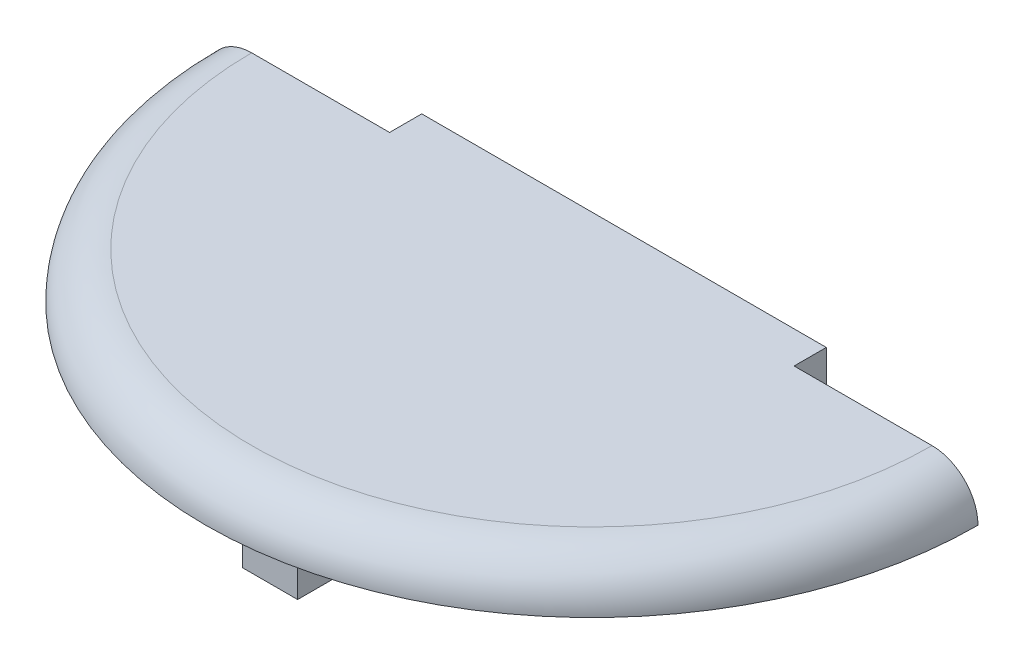
ISO-10303-21;
HEADER;
FILE_DESCRIPTION(('STEP AP214'),'2;1');
FILE_NAME('part.step','',(''),(''),'','','');
FILE_SCHEMA(('AUTOMOTIVE_DESIGN { 1 0 10303 214 1 1 1 1 }'));
ENDSEC;
DATA;
#1=APPLICATION_CONTEXT('core data for automotive mechanical design processes');
#2=APPLICATION_PROTOCOL_DEFINITION('international standard','automotive_design',2000,#1);
#3=PRODUCT_CONTEXT('',#1,'mechanical');
#4=PRODUCT('Part','Part','',(#3));
#5=PRODUCT_RELATED_PRODUCT_CATEGORY('part','',(#4));
#6=PRODUCT_DEFINITION_FORMATION('','',#4);
#7=PRODUCT_DEFINITION_CONTEXT('part definition',#1,'design');
#8=PRODUCT_DEFINITION('design','',#6,#7);
#9=PRODUCT_DEFINITION_SHAPE('','',#8);
#10=(LENGTH_UNIT() NAMED_UNIT(*) SI_UNIT(.MILLI.,.METRE.));
#11=(NAMED_UNIT(*) PLANE_ANGLE_UNIT() SI_UNIT($,.RADIAN.));
#12=(NAMED_UNIT(*) SI_UNIT($,.STERADIAN.) SOLID_ANGLE_UNIT());
#13=UNCERTAINTY_MEASURE_WITH_UNIT(LENGTH_MEASURE(1.E-05),#10,'distance_accuracy_value','');
#14=(GEOMETRIC_REPRESENTATION_CONTEXT(3) GLOBAL_UNCERTAINTY_ASSIGNED_CONTEXT((#13)) GLOBAL_UNIT_ASSIGNED_CONTEXT((#10,
#11,#12)) REPRESENTATION_CONTEXT('',''));
#15=CARTESIAN_POINT('',(0.,0.,0.));
#16=DIRECTION('',(0.,0.,1.));
#17=DIRECTION('',(1.,0.,0.));
#18=AXIS2_PLACEMENT_3D('',#15,#16,#17);
#19=CARTESIAN_POINT('',(-2.99999999999999,47.,32.));
#20=DIRECTION('',(0.,0.,1.));
#21=DIRECTION('',(1.,0.,0.));
#22=AXIS2_PLACEMENT_3D('',#19,#20,#21);
#23=PLANE('',#22);
#24=DIRECTION('',(1.,0.,0.));
#25=VECTOR('',#24,1.);
#26=CARTESIAN_POINT('',(-2.99999999999999,48.,32.));
#27=LINE('',#26,#25);
#28=CARTESIAN_POINT('',(-2.99999999999999,48.,32.));
#29=VERTEX_POINT('',#28);
#30=CARTESIAN_POINT('',(3.00000000000001,48.,32.));
#31=VERTEX_POINT('',#30);
#32=EDGE_CURVE('E12',#29,#31,#27,.T.);
#33=ORIENTED_EDGE('',*,*,#32,.F.);
#34=DIRECTION('',(0.,1.,0.));
#35=VECTOR('',#34,1.);
#36=CARTESIAN_POINT('',(-2.99999999999999,47.,32.));
#37=LINE('',#36,#35);
#38=CARTESIAN_POINT('',(-2.99999999999999,55.,32.));
#39=VERTEX_POINT('',#38);
#40=EDGE_CURVE('E226',#29,#39,#37,.T.);
#41=ORIENTED_EDGE('',*,*,#40,.T.);
#42=DIRECTION('',(1.,0.,0.));
#43=VECTOR('',#42,1.);
#44=CARTESIAN_POINT('',(-2.99999999999999,55.,32.));
#45=LINE('',#44,#43);
#46=CARTESIAN_POINT('',(3.00000000000001,55.,32.));
#47=VERTEX_POINT('',#46);
#48=EDGE_CURVE('E219',#39,#47,#45,.T.);
#49=ORIENTED_EDGE('',*,*,#48,.T.);
#50=DIRECTION('',(0.,1.,0.));
#51=VECTOR('',#50,1.);
#52=CARTESIAN_POINT('',(3.00000000000001,47.,32.));
#53=LINE('',#52,#51);
#54=EDGE_CURVE('E223',#31,#47,#53,.T.);
#55=ORIENTED_EDGE('',*,*,#54,.F.);
#56=EDGE_LOOP('',(#33,#41,#49,#55));
#57=FACE_BOUND('',#56,.T.);
#58=ADVANCED_FACE('F42',(#57),#23,.F.);
#59=CARTESIAN_POINT('',(0.,55.,0.));
#60=DIRECTION('',(0.,1.,0.));
#61=DIRECTION('',(0.,0.,1.));
#62=AXIS2_PLACEMENT_3D('',#59,#60,#61);
#63=PLANE('',#62);
#64=DIRECTION('',(0.,0.,-1.));
#65=VECTOR('',#64,1.);
#66=CARTESIAN_POINT('',(-22.,55.,0.));
#67=LINE('',#66,#65);
#68=CARTESIAN_POINT('',(-22.,55.,0.));
#69=VERTEX_POINT('',#68);
#70=CARTESIAN_POINT('',(-22.,55.,-3.5));
#71=VERTEX_POINT('',#70);
#72=EDGE_CURVE('E144',#69,#71,#67,.T.);
#73=ORIENTED_EDGE('',*,*,#72,.T.);
#74=DIRECTION('',(1.,0.,0.));
#75=VECTOR('',#74,1.);
#76=CARTESIAN_POINT('',(-22.,55.,-3.5));
#77=LINE('',#76,#75);
#78=CARTESIAN_POINT('',(22.,55.,-3.5));
#79=VERTEX_POINT('',#78);
#80=EDGE_CURVE('E130',#71,#79,#77,.T.);
#81=ORIENTED_EDGE('',*,*,#80,.T.);
#82=DIRECTION('',(0.,0.,1.));
#83=VECTOR('',#82,1.);
#84=CARTESIAN_POINT('',(22.,55.,0.));
#85=LINE('',#84,#83);
#86=CARTESIAN_POINT('',(22.,55.,0.));
#87=VERTEX_POINT('',#86);
#88=EDGE_CURVE('E156',#79,#87,#85,.T.);
#89=ORIENTED_EDGE('',*,*,#88,.T.);
#90=DIRECTION('',(1.,0.,0.));
#91=VECTOR('',#90,1.);
#92=CARTESIAN_POINT('',(0.,55.,0.));
#93=LINE('',#92,#91);
#94=CARTESIAN_POINT('',(42.,55.,0.));
#95=VERTEX_POINT('',#94);
#96=EDGE_CURVE('E163',#87,#95,#93,.T.);
#97=ORIENTED_EDGE('',*,*,#96,.T.);
#98=CARTESIAN_POINT('',(0.,55.,0.));
#99=DIRECTION('',(0.,-1.,0.));
#100=DIRECTION('',(0.,0.,-1.));
#101=AXIS2_PLACEMENT_3D('',#98,#99,#100);
#102=CIRCLE('',#101,42.);
#103=CARTESIAN_POINT('',(-42.,55.,0.));
#104=VERTEX_POINT('',#103);
#105=EDGE_CURVE('E52',#95,#104,#102,.T.);
#106=ORIENTED_EDGE('',*,*,#105,.T.);
#107=DIRECTION('',(1.,0.,0.));
#108=VECTOR('',#107,1.);
#109=CARTESIAN_POINT('',(0.,55.,0.));
#110=LINE('',#109,#108);
#111=EDGE_CURVE('E153',#104,#69,#110,.T.);
#112=ORIENTED_EDGE('',*,*,#111,.T.);
#113=EDGE_LOOP('',(#73,#81,#89,#97,#106,#112));
#114=FACE_BOUND('',#113,.T.);
#115=DIRECTION('',(0.,0.,1.));
#116=VECTOR('',#115,1.);
#117=CARTESIAN_POINT('',(3.00000000000001,55.,35.));
#118=LINE('',#117,#116);
#119=CARTESIAN_POINT('',(3.00000000000001,55.,35.));
#120=VERTEX_POINT('',#119);
#121=EDGE_CURVE('E205',#47,#120,#118,.T.);
#122=ORIENTED_EDGE('',*,*,#121,.F.);
#123=ORIENTED_EDGE('',*,*,#48,.F.);
#124=DIRECTION('',(0.,0.,-1.));
#125=VECTOR('',#124,1.);
#126=CARTESIAN_POINT('',(-2.99999999999999,55.,35.));
#127=LINE('',#126,#125);
#128=CARTESIAN_POINT('',(-2.99999999999999,55.,35.));
#129=VERTEX_POINT('',#128);
#130=EDGE_CURVE('E215',#129,#39,#127,.T.);
#131=ORIENTED_EDGE('',*,*,#130,.F.);
#132=DIRECTION('',(-1.,0.,0.));
#133=VECTOR('',#132,1.);
#134=CARTESIAN_POINT('',(-2.99999999999999,55.,35.));
#135=LINE('',#134,#133);
#136=EDGE_CURVE('E211',#120,#129,#135,.T.);
#137=ORIENTED_EDGE('',*,*,#136,.F.);
#138=EDGE_LOOP('',(#122,#123,#131,#137));
#139=FACE_BOUND('',#138,.T.);
#140=ADVANCED_FACE('F44',(#114,#139),#63,.F.);
#141=CARTESIAN_POINT('',(37.,60.,0.));
#142=DIRECTION('',(0.,1.,0.));
#143=DIRECTION('',(0.,0.,1.));
#144=AXIS2_PLACEMENT_3D('',#141,#142,#143);
#145=PLANE('',#144);
#146=DIRECTION('',(1.,0.,0.));
#147=VECTOR('',#146,1.);
#148=CARTESIAN_POINT('',(-22.,60.,-3.5));
#149=LINE('',#148,#147);
#150=CARTESIAN_POINT('',(-22.,60.,-3.5));
#151=VERTEX_POINT('',#150);
#152=CARTESIAN_POINT('',(22.,60.,-3.5));
#153=VERTEX_POINT('',#152);
#154=EDGE_CURVE('E60',#151,#153,#149,.T.);
#155=ORIENTED_EDGE('',*,*,#154,.F.);
#156=DIRECTION('',(0.,0.,-1.));
#157=VECTOR('',#156,1.);
#158=CARTESIAN_POINT('',(-22.,60.,-7.));
#159=LINE('',#158,#157);
#160=CARTESIAN_POINT('',(-22.,60.,0.));
#161=VERTEX_POINT('',#160);
#162=EDGE_CURVE('E147',#161,#151,#159,.T.);
#163=ORIENTED_EDGE('',*,*,#162,.F.);
#164=DIRECTION('',(1.,0.,0.));
#165=VECTOR('',#164,1.);
#166=CARTESIAN_POINT('',(-42.,60.,0.));
#167=LINE('',#166,#165);
#168=CARTESIAN_POINT('',(-37.,60.,0.));
#169=VERTEX_POINT('',#168);
#170=EDGE_CURVE('E258',#169,#161,#167,.T.);
#171=ORIENTED_EDGE('',*,*,#170,.F.);
#172=CARTESIAN_POINT('',(0.,60.,0.));
#173=DIRECTION('',(0.,-1.,0.));
#174=DIRECTION('',(0.,0.,-1.));
#175=AXIS2_PLACEMENT_3D('',#172,#173,#174);
#176=CIRCLE('',#175,37.);
#177=CARTESIAN_POINT('',(37.,60.,0.));
#178=VERTEX_POINT('',#177);
#179=EDGE_CURVE('E241',#178,#169,#176,.T.);
#180=ORIENTED_EDGE('',*,*,#179,.F.);
#181=DIRECTION('',(1.,0.,0.));
#182=VECTOR('',#181,1.);
#183=CARTESIAN_POINT('',(42.,60.,0.));
#184=LINE('',#183,#182);
#185=CARTESIAN_POINT('',(22.,60.,0.));
#186=VERTEX_POINT('',#185);
#187=EDGE_CURVE('E265',#186,#178,#184,.T.);
#188=ORIENTED_EDGE('',*,*,#187,.F.);
#189=DIRECTION('',(0.,0.,1.));
#190=VECTOR('',#189,1.);
#191=CARTESIAN_POINT('',(22.,60.,-7.));
#192=LINE('',#191,#190);
#193=EDGE_CURVE('E262',#153,#186,#192,.T.);
#194=ORIENTED_EDGE('',*,*,#193,.F.);
#195=EDGE_LOOP('',(#155,#163,#171,#180,#188,#194));
#196=FACE_BOUND('',#195,.T.);
#197=ADVANCED_FACE('F295',(#196),#145,.T.);
#198=CARTESIAN_POINT('',(0.,55.,0.));
#199=DIRECTION('',(0.,-1.,0.));
#200=DIRECTION('',(0.,0.,-1.));
#201=AXIS2_PLACEMENT_3D('',#198,#199,#200);
#202=TOROIDAL_SURFACE('',#201,37.,5.);
#203=CARTESIAN_POINT('',(-37.,55.,0.));
#204=DIRECTION('',(0.,0.,1.));
#205=DIRECTION('',(1.,0.,0.));
#206=AXIS2_PLACEMENT_3D('',#203,#204,#205);
#207=CIRCLE('',#206,5.);
#208=EDGE_CURVE('E238',#104,#169,#207,.F.);
#209=ORIENTED_EDGE('',*,*,#208,.F.);
#210=ORIENTED_EDGE('',*,*,#105,.F.);
#211=CARTESIAN_POINT('',(37.,55.,0.));
#212=DIRECTION('',(0.,0.,1.));
#213=DIRECTION('',(1.,0.,0.));
#214=AXIS2_PLACEMENT_3D('',#211,#212,#213);
#215=CIRCLE('',#214,5.);
#216=EDGE_CURVE('E235',#178,#95,#215,.F.);
#217=ORIENTED_EDGE('',*,*,#216,.F.);
#218=ORIENTED_EDGE('',*,*,#179,.T.);
#219=EDGE_LOOP('',(#209,#210,#217,#218));
#220=FACE_BOUND('',#219,.T.);
#221=ADVANCED_FACE('F300',(#220),#202,.T.);
#222=CARTESIAN_POINT('',(3.00000000000001,47.,35.));
#223=DIRECTION('',(-1.,0.,0.));
#224=DIRECTION('',(0.,0.,1.));
#225=AXIS2_PLACEMENT_3D('',#222,#223,#224);
#226=PLANE('',#225);
#227=DIRECTION('',(0.,0.,1.));
#228=VECTOR('',#227,1.);
#229=CARTESIAN_POINT('',(3.00000000000001,48.,35.));
#230=LINE('',#229,#228);
#231=CARTESIAN_POINT('',(3.00000000000001,48.,29.));
#232=VERTEX_POINT('',#231);
#233=EDGE_CURVE('E197',#232,#31,#230,.T.);
#234=ORIENTED_EDGE('',*,*,#233,.T.);
#235=ORIENTED_EDGE('',*,*,#54,.T.);
#236=ORIENTED_EDGE('',*,*,#121,.T.);
#237=DIRECTION('',(0.,1.,0.));
#238=VECTOR('',#237,1.);
#239=CARTESIAN_POINT('',(3.00000000000001,47.,35.));
#240=LINE('',#239,#238);
#241=CARTESIAN_POINT('',(3.00000000000001,46.,35.));
#242=VERTEX_POINT('',#241);
#243=EDGE_CURVE('E232',#242,#120,#240,.T.);
#244=ORIENTED_EDGE('',*,*,#243,.F.);
#245=DIRECTION('',(0.,0.,1.));
#246=VECTOR('',#245,1.);
#247=CARTESIAN_POINT('',(3.00000000000001,46.,35.));
#248=LINE('',#247,#246);
#249=CARTESIAN_POINT('',(3.00000000000001,46.,29.));
#250=VERTEX_POINT('',#249);
#251=EDGE_CURVE('E182',#250,#242,#248,.T.);
#252=ORIENTED_EDGE('',*,*,#251,.F.);
#253=DIRECTION('',(0.,-1.,0.));
#254=VECTOR('',#253,1.);
#255=CARTESIAN_POINT('',(3.00000000000001,48.,29.));
#256=LINE('',#255,#254);
#257=EDGE_CURVE('E202',#232,#250,#256,.T.);
#258=ORIENTED_EDGE('',*,*,#257,.F.);
#259=EDGE_LOOP('',(#234,#235,#236,#244,#252,#258));
#260=FACE_BOUND('',#259,.T.);
#261=ADVANCED_FACE('F345',(#260),#226,.F.);
#262=CARTESIAN_POINT('',(-2.99999999999999,47.,35.));
#263=DIRECTION('',(0.,0.,-1.));
#264=DIRECTION('',(-1.,0.,0.));
#265=AXIS2_PLACEMENT_3D('',#262,#263,#264);
#266=PLANE('',#265);
#267=ORIENTED_EDGE('',*,*,#243,.T.);
#268=ORIENTED_EDGE('',*,*,#136,.T.);
#269=DIRECTION('',(0.,1.,0.));
#270=VECTOR('',#269,1.);
#271=CARTESIAN_POINT('',(-2.99999999999999,47.,35.));
#272=LINE('',#271,#270);
#273=CARTESIAN_POINT('',(-2.99999999999999,46.,35.));
#274=VERTEX_POINT('',#273);
#275=EDGE_CURVE('E229',#274,#129,#272,.T.);
#276=ORIENTED_EDGE('',*,*,#275,.F.);
#277=DIRECTION('',(-1.,0.,0.));
#278=VECTOR('',#277,1.);
#279=CARTESIAN_POINT('',(-2.99999999999999,46.,35.));
#280=LINE('',#279,#278);
#281=EDGE_CURVE('E186',#242,#274,#280,.T.);
#282=ORIENTED_EDGE('',*,*,#281,.F.);
#283=EDGE_LOOP('',(#267,#268,#276,#282));
#284=FACE_BOUND('',#283,.T.);
#285=ADVANCED_FACE('F341',(#284),#266,.F.);
#286=CARTESIAN_POINT('',(-2.99999999999999,47.,35.));
#287=DIRECTION('',(1.,0.,0.));
#288=DIRECTION('',(0.,0.,-1.));
#289=AXIS2_PLACEMENT_3D('',#286,#287,#288);
#290=PLANE('',#289);
#291=ORIENTED_EDGE('',*,*,#275,.T.);
#292=ORIENTED_EDGE('',*,*,#130,.T.);
#293=ORIENTED_EDGE('',*,*,#40,.F.);
#294=DIRECTION('',(0.,0.,-1.));
#295=VECTOR('',#294,1.);
#296=CARTESIAN_POINT('',(-2.99999999999999,48.,35.));
#297=LINE('',#296,#295);
#298=CARTESIAN_POINT('',(-2.99999999999999,48.,29.));
#299=VERTEX_POINT('',#298);
#300=EDGE_CURVE('E190',#29,#299,#297,.T.);
#301=ORIENTED_EDGE('',*,*,#300,.T.);
#302=DIRECTION('',(0.,-1.,0.));
#303=VECTOR('',#302,1.);
#304=CARTESIAN_POINT('',(-2.99999999999999,48.,29.));
#305=LINE('',#304,#303);
#306=CARTESIAN_POINT('',(-2.99999999999999,46.,29.));
#307=VERTEX_POINT('',#306);
#308=EDGE_CURVE('E201',#299,#307,#305,.T.);
#309=ORIENTED_EDGE('',*,*,#308,.T.);
#310=DIRECTION('',(0.,0.,-1.));
#311=VECTOR('',#310,1.);
#312=CARTESIAN_POINT('',(-2.99999999999999,46.,35.));
#313=LINE('',#312,#311);
#314=EDGE_CURVE('E174',#274,#307,#313,.T.);
#315=ORIENTED_EDGE('',*,*,#314,.F.);
#316=EDGE_LOOP('',(#291,#292,#293,#301,#309,#315));
#317=FACE_BOUND('',#316,.T.);
#318=ADVANCED_FACE('F337',(#317),#290,.F.);
#319=CARTESIAN_POINT('',(0.,48.,0.));
#320=DIRECTION('',(0.,-1.,0.));
#321=DIRECTION('',(0.,0.,-1.));
#322=AXIS2_PLACEMENT_3D('',#319,#320,#321);
#323=PLANE('',#322);
#324=ORIENTED_EDGE('',*,*,#300,.F.);
#325=ORIENTED_EDGE('',*,*,#32,.T.);
#326=ORIENTED_EDGE('',*,*,#233,.F.);
#327=DIRECTION('',(1.,0.,0.));
#328=VECTOR('',#327,1.);
#329=CARTESIAN_POINT('',(-2.99999999999999,48.,29.));
#330=LINE('',#329,#328);
#331=EDGE_CURVE('E193',#299,#232,#330,.T.);
#332=ORIENTED_EDGE('',*,*,#331,.F.);
#333=EDGE_LOOP('',(#324,#325,#326,#332));
#334=FACE_BOUND('',#333,.T.);
#335=ADVANCED_FACE('F340',(#334),#323,.F.);
#336=CARTESIAN_POINT('',(-2.99999999999999,48.,29.));
#337=DIRECTION('',(0.,0.,-1.));
#338=DIRECTION('',(-1.,0.,0.));
#339=AXIS2_PLACEMENT_3D('',#336,#337,#338);
#340=PLANE('',#339);
#341=ORIENTED_EDGE('',*,*,#257,.T.);
#342=DIRECTION('',(1.,0.,0.));
#343=VECTOR('',#342,1.);
#344=CARTESIAN_POINT('',(-2.99999999999999,46.,29.));
#345=LINE('',#344,#343);
#346=EDGE_CURVE('E178',#307,#250,#345,.T.);
#347=ORIENTED_EDGE('',*,*,#346,.F.);
#348=ORIENTED_EDGE('',*,*,#308,.F.);
#349=ORIENTED_EDGE('',*,*,#331,.T.);
#350=EDGE_LOOP('',(#341,#347,#348,#349));
#351=FACE_BOUND('',#350,.T.);
#352=ADVANCED_FACE('F335',(#351),#340,.T.);
#353=CARTESIAN_POINT('',(0.,46.,0.));
#354=DIRECTION('',(0.,-1.,0.));
#355=DIRECTION('',(0.,0.,-1.));
#356=AXIS2_PLACEMENT_3D('',#353,#354,#355);
#357=PLANE('',#356);
#358=ORIENTED_EDGE('',*,*,#314,.T.);
#359=ORIENTED_EDGE('',*,*,#346,.T.);
#360=ORIENTED_EDGE('',*,*,#251,.T.);
#361=ORIENTED_EDGE('',*,*,#281,.T.);
#362=EDGE_LOOP('',(#358,#359,#360,#361));
#363=FACE_BOUND('',#362,.T.);
#364=ADVANCED_FACE('F418',(#363),#357,.T.);
#365=CARTESIAN_POINT('',(-22.,53.,-7.));
#366=DIRECTION('',(1.,0.,0.));
#367=DIRECTION('',(0.,0.,-1.));
#368=AXIS2_PLACEMENT_3D('',#365,#366,#367);
#369=PLANE('',#368);
#370=ORIENTED_EDGE('',*,*,#162,.T.);
#371=DIRECTION('',(0.,1.,0.));
#372=VECTOR('',#371,1.);
#373=CARTESIAN_POINT('',(-22.,55.,-3.5));
#374=LINE('',#373,#372);
#375=EDGE_CURVE('E134',#71,#151,#374,.T.);
#376=ORIENTED_EDGE('',*,*,#375,.F.);
#377=ORIENTED_EDGE('',*,*,#72,.F.);
#378=DIRECTION('',(0.,1.,0.));
#379=VECTOR('',#378,1.);
#380=CARTESIAN_POINT('',(-22.,53.,0.));
#381=LINE('',#380,#379);
#382=EDGE_CURVE('E249',#69,#161,#381,.T.);
#383=ORIENTED_EDGE('',*,*,#382,.T.);
#384=EDGE_LOOP('',(#370,#376,#377,#383));
#385=FACE_BOUND('',#384,.T.);
#386=ADVANCED_FACE('F143',(#385),#369,.F.);
#387=CARTESIAN_POINT('',(-42.,53.,0.));
#388=DIRECTION('',(0.,0.,1.));
#389=DIRECTION('',(1.,0.,0.));
#390=AXIS2_PLACEMENT_3D('',#387,#388,#389);
#391=PLANE('',#390);
#392=CARTESIAN_POINT('',(-30.,57.5,0.));
#393=DIRECTION('',(0.,0.,1.));
#394=DIRECTION('',(1.,0.,0.));
#395=AXIS2_PLACEMENT_3D('',#392,#393,#394);
#396=CIRCLE('',#395,1.5);
#397=CARTESIAN_POINT('',(-28.5,57.5,0.));
#398=VERTEX_POINT('',#397);
#399=EDGE_CURVE('E246',#398,#398,#396,.F.);
#400=ORIENTED_EDGE('',*,*,#399,.F.);
#401=EDGE_LOOP('',(#400));
#402=FACE_BOUND('',#401,.T.);
#403=ORIENTED_EDGE('',*,*,#208,.T.);
#404=ORIENTED_EDGE('',*,*,#170,.T.);
#405=ORIENTED_EDGE('',*,*,#382,.F.);
#406=ORIENTED_EDGE('',*,*,#111,.F.);
#407=EDGE_LOOP('',(#403,#404,#405,#406));
#408=FACE_BOUND('',#407,.T.);
#409=ADVANCED_FACE('F302',(#402,#408),#391,.F.);
#410=CARTESIAN_POINT('',(22.,53.,-7.));
#411=DIRECTION('',(-1.,0.,0.));
#412=DIRECTION('',(0.,0.,1.));
#413=AXIS2_PLACEMENT_3D('',#410,#411,#412);
#414=PLANE('',#413);
#415=ORIENTED_EDGE('',*,*,#88,.F.);
#416=DIRECTION('',(0.,1.,0.));
#417=VECTOR('',#416,1.);
#418=CARTESIAN_POINT('',(22.,55.,-3.5));
#419=LINE('',#418,#417);
#420=EDGE_CURVE('E135',#79,#153,#419,.T.);
#421=ORIENTED_EDGE('',*,*,#420,.T.);
#422=ORIENTED_EDGE('',*,*,#193,.T.);
#423=DIRECTION('',(0.,1.,0.));
#424=VECTOR('',#423,1.);
#425=CARTESIAN_POINT('',(22.,53.,0.));
#426=LINE('',#425,#424);
#427=EDGE_CURVE('E269',#87,#186,#426,.T.);
#428=ORIENTED_EDGE('',*,*,#427,.F.);
#429=EDGE_LOOP('',(#415,#421,#422,#428));
#430=FACE_BOUND('',#429,.T.);
#431=ADVANCED_FACE('F287',(#430),#414,.F.);
#432=CARTESIAN_POINT('',(42.,53.,0.));
#433=DIRECTION('',(0.,0.,1.));
#434=DIRECTION('',(1.,0.,0.));
#435=AXIS2_PLACEMENT_3D('',#432,#433,#434);
#436=PLANE('',#435);
#437=CARTESIAN_POINT('',(30.,57.5,0.));
#438=DIRECTION('',(0.,0.,1.));
#439=DIRECTION('',(1.,0.,0.));
#440=AXIS2_PLACEMENT_3D('',#437,#438,#439);
#441=CIRCLE('',#440,1.5);
#442=CARTESIAN_POINT('',(31.5,57.5,0.));
#443=VERTEX_POINT('',#442);
#444=EDGE_CURVE('E46',#443,#443,#441,.F.);
#445=ORIENTED_EDGE('',*,*,#444,.F.);
#446=EDGE_LOOP('',(#445));
#447=FACE_BOUND('',#446,.T.);
#448=ORIENTED_EDGE('',*,*,#427,.T.);
#449=ORIENTED_EDGE('',*,*,#187,.T.);
#450=ORIENTED_EDGE('',*,*,#216,.T.);
#451=ORIENTED_EDGE('',*,*,#96,.F.);
#452=EDGE_LOOP('',(#448,#449,#450,#451));
#453=FACE_BOUND('',#452,.T.);
#454=ADVANCED_FACE('F283',(#447,#453),#436,.F.);
#455=CARTESIAN_POINT('',(-30.,57.5,1.));
#456=DIRECTION('',(0.,0.,-1.));
#457=DIRECTION('',(-1.,0.,0.));
#458=AXIS2_PLACEMENT_3D('',#455,#456,#457);
#459=PLANE('',#458);
#460=CARTESIAN_POINT('',(-30.,57.5,1.));
#461=DIRECTION('',(0.,0.,-1.));
#462=DIRECTION('',(-1.,0.,0.));
#463=AXIS2_PLACEMENT_3D('',#460,#461,#462);
#464=CIRCLE('',#463,1.5);
#465=CARTESIAN_POINT('',(-31.5,57.5,1.));
#466=VERTEX_POINT('',#465);
#467=EDGE_CURVE('E155',#466,#466,#464,.T.);
#468=ORIENTED_EDGE('',*,*,#467,.T.);
#469=EDGE_LOOP('',(#468));
#470=FACE_BOUND('',#469,.T.);
#471=ADVANCED_FACE('F286',(#470),#459,.T.);
#472=CARTESIAN_POINT('',(-30.,57.5,1.));
#473=DIRECTION('',(0.,0.,-1.));
#474=DIRECTION('',(-1.,0.,0.));
#475=AXIS2_PLACEMENT_3D('',#472,#473,#474);
#476=CYLINDRICAL_SURFACE('',#475,1.5);
#477=ORIENTED_EDGE('',*,*,#399,.T.);
#478=EDGE_LOOP('',(#477));
#479=FACE_BOUND('',#478,.T.);
#480=ORIENTED_EDGE('',*,*,#467,.F.);
#481=EDGE_LOOP('',(#480));
#482=FACE_BOUND('',#481,.T.);
#483=ADVANCED_FACE('F384',(#479,#482),#476,.F.);
#484=CARTESIAN_POINT('',(30.,57.5,1.));
#485=DIRECTION('',(0.,0.,-1.));
#486=DIRECTION('',(-1.,0.,0.));
#487=AXIS2_PLACEMENT_3D('',#484,#485,#486);
#488=PLANE('',#487);
#489=CARTESIAN_POINT('',(30.,57.5,1.));
#490=DIRECTION('',(0.,0.,-1.));
#491=DIRECTION('',(-1.,0.,0.));
#492=AXIS2_PLACEMENT_3D('',#489,#490,#491);
#493=CIRCLE('',#492,1.5);
#494=CARTESIAN_POINT('',(28.5,57.5,1.));
#495=VERTEX_POINT('',#494);
#496=EDGE_CURVE('E161',#495,#495,#493,.T.);
#497=ORIENTED_EDGE('',*,*,#496,.T.);
#498=EDGE_LOOP('',(#497));
#499=FACE_BOUND('',#498,.T.);
#500=ADVANCED_FACE('F324',(#499),#488,.T.);
#501=CARTESIAN_POINT('',(30.,57.5,1.));
#502=DIRECTION('',(0.,0.,-1.));
#503=DIRECTION('',(-1.,0.,0.));
#504=AXIS2_PLACEMENT_3D('',#501,#502,#503);
#505=CYLINDRICAL_SURFACE('',#504,1.5);
#506=ORIENTED_EDGE('',*,*,#444,.T.);
#507=EDGE_LOOP('',(#506));
#508=FACE_BOUND('',#507,.T.);
#509=ORIENTED_EDGE('',*,*,#496,.F.);
#510=EDGE_LOOP('',(#509));
#511=FACE_BOUND('',#510,.T.);
#512=ADVANCED_FACE('F280',(#508,#511),#505,.F.);
#513=CARTESIAN_POINT('',(-22.,55.,-3.5));
#514=DIRECTION('',(0.,0.,1.));
#515=DIRECTION('',(1.,0.,0.));
#516=AXIS2_PLACEMENT_3D('',#513,#514,#515);
#517=PLANE('',#516);
#518=ORIENTED_EDGE('',*,*,#154,.T.);
#519=ORIENTED_EDGE('',*,*,#420,.F.);
#520=ORIENTED_EDGE('',*,*,#80,.F.);
#521=ORIENTED_EDGE('',*,*,#375,.T.);
#522=EDGE_LOOP('',(#518,#519,#520,#521));
#523=FACE_BOUND('',#522,.T.);
#524=CARTESIAN_POINT('',(0.,57.5,-3.5));
#525=DIRECTION('',(0.,0.,1.));
#526=DIRECTION('',(1.,0.,0.));
#527=AXIS2_PLACEMENT_3D('',#524,#525,#526);
#528=CIRCLE('',#527,1.5);
#529=CARTESIAN_POINT('',(1.5,57.5,-3.5));
#530=VERTEX_POINT('',#529);
#531=EDGE_CURVE('E266',#530,#530,#528,.F.);
#532=ORIENTED_EDGE('',*,*,#531,.F.);
#533=EDGE_LOOP('',(#532));
#534=FACE_BOUND('',#533,.T.);
#535=ADVANCED_FACE('F132',(#523,#534),#517,.F.);
#536=CARTESIAN_POINT('',(0.,57.5,1.));
#537=DIRECTION('',(0.,0.,-1.));
#538=DIRECTION('',(-1.,0.,0.));
#539=AXIS2_PLACEMENT_3D('',#536,#537,#538);
#540=PLANE('',#539);
#541=CARTESIAN_POINT('',(0.,57.5,1.));
#542=DIRECTION('',(0.,0.,-1.));
#543=DIRECTION('',(-1.,0.,0.));
#544=AXIS2_PLACEMENT_3D('',#541,#542,#543);
#545=CIRCLE('',#544,1.5);
#546=CARTESIAN_POINT('',(-1.5,57.5,1.));
#547=VERTEX_POINT('',#546);
#548=EDGE_CURVE('E169',#547,#547,#545,.T.);
#549=ORIENTED_EDGE('',*,*,#548,.T.);
#550=EDGE_LOOP('',(#549));
#551=FACE_BOUND('',#550,.T.);
#552=ADVANCED_FACE('F316',(#551),#540,.T.);
#553=CARTESIAN_POINT('',(0.,57.5,1.));
#554=DIRECTION('',(0.,0.,-1.));
#555=DIRECTION('',(-1.,0.,0.));
#556=AXIS2_PLACEMENT_3D('',#553,#554,#555);
#557=CYLINDRICAL_SURFACE('',#556,1.5);
#558=ORIENTED_EDGE('',*,*,#531,.T.);
#559=EDGE_LOOP('',(#558));
#560=FACE_BOUND('',#559,.T.);
#561=ORIENTED_EDGE('',*,*,#548,.F.);
#562=EDGE_LOOP('',(#561));
#563=FACE_BOUND('',#562,.T.);
#564=ADVANCED_FACE('F313',(#560,#563),#557,.F.);
#565=CLOSED_SHELL('',(#58,#140,#197,#221,#261,#285,#318,#335,#352,#364,#386,#409,#431,#454,#471,
#483,#500,#512,#535,#552,#564));
#566=MANIFOLD_SOLID_BREP('B2',#565);
#567=ADVANCED_BREP_SHAPE_REPRESENTATION('',(#18,#566),#14);
#568=SHAPE_DEFINITION_REPRESENTATION(#9,#567);
ENDSEC;
END-ISO-10303-21;
